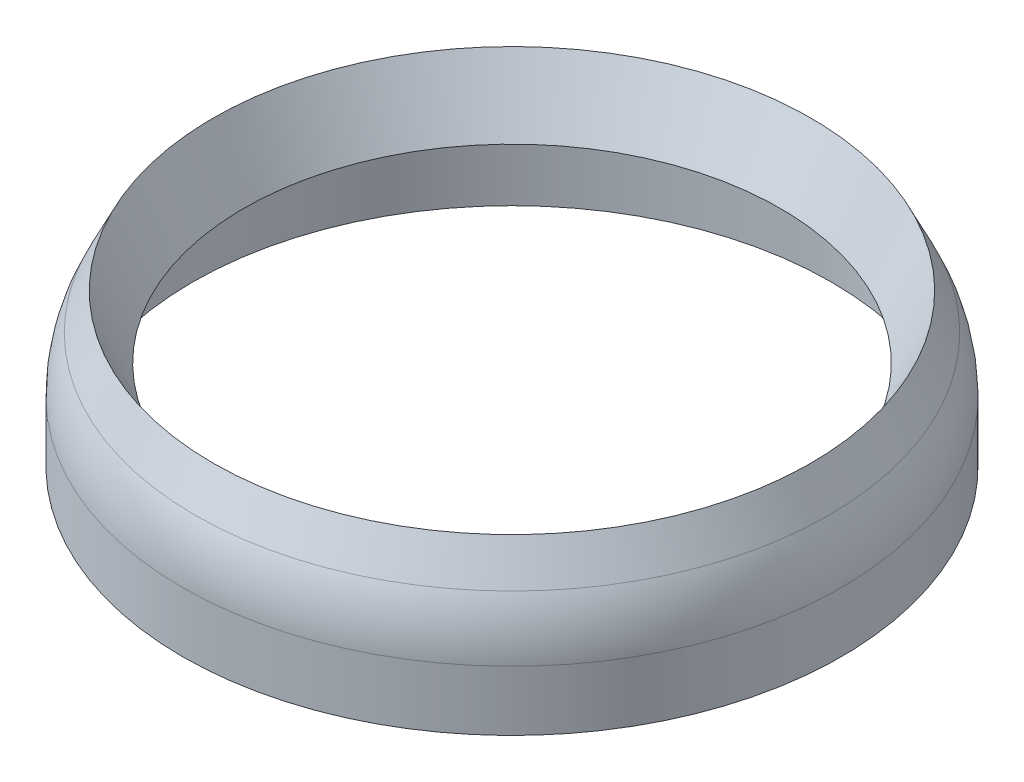
ISO-10303-21;
HEADER;
FILE_DESCRIPTION(('STEP AP214'),'2;1');
FILE_NAME('part.step','',(''),(''),'','','');
FILE_SCHEMA(('AUTOMOTIVE_DESIGN { 1 0 10303 214 1 1 1 1 }'));
ENDSEC;
DATA;
#1=APPLICATION_CONTEXT('core data for automotive mechanical design processes');
#2=APPLICATION_PROTOCOL_DEFINITION('international standard','automotive_design',2000,#1);
#3=PRODUCT_CONTEXT('',#1,'mechanical');
#4=PRODUCT('Part','Part','',(#3));
#5=PRODUCT_RELATED_PRODUCT_CATEGORY('part','',(#4));
#6=PRODUCT_DEFINITION_FORMATION('','',#4);
#7=PRODUCT_DEFINITION_CONTEXT('part definition',#1,'design');
#8=PRODUCT_DEFINITION('design','',#6,#7);
#9=PRODUCT_DEFINITION_SHAPE('','',#8);
#10=(LENGTH_UNIT() NAMED_UNIT(*) SI_UNIT(.MILLI.,.METRE.));
#11=(NAMED_UNIT(*) PLANE_ANGLE_UNIT() SI_UNIT($,.RADIAN.));
#12=(NAMED_UNIT(*) SI_UNIT($,.STERADIAN.) SOLID_ANGLE_UNIT());
#13=UNCERTAINTY_MEASURE_WITH_UNIT(LENGTH_MEASURE(1.E-05),#10,'distance_accuracy_value','');
#14=(GEOMETRIC_REPRESENTATION_CONTEXT(3) GLOBAL_UNCERTAINTY_ASSIGNED_CONTEXT((#13)) GLOBAL_UNIT_ASSIGNED_CONTEXT((#10,
#11,#12)) REPRESENTATION_CONTEXT('',''));
#15=CARTESIAN_POINT('',(0.,0.,0.));
#16=DIRECTION('',(0.,0.,1.));
#17=DIRECTION('',(1.,0.,0.));
#18=AXIS2_PLACEMENT_3D('',#15,#16,#17);
#19=CARTESIAN_POINT('',(0.,-7.,0.));
#20=DIRECTION('',(0.,1.,0.));
#21=DIRECTION('',(0.,0.,1.));
#22=AXIS2_PLACEMENT_3D('',#19,#20,#21);
#23=CYLINDRICAL_SURFACE('',#22,25.8);
#24=CARTESIAN_POINT('',(0.,-2.30868191125563,0.));
#25=DIRECTION('',(0.,-1.,0.));
#26=DIRECTION('',(0.,0.,-1.));
#27=AXIS2_PLACEMENT_3D('',#24,#25,#26);
#28=CIRCLE('',#27,25.8);
#29=CARTESIAN_POINT('',(0.,-2.30868191125563,-25.8));
#30=VERTEX_POINT('',#29);
#31=EDGE_CURVE('E10',#30,#30,#28,.T.);
#32=ORIENTED_EDGE('',*,*,#31,.T.);
#33=EDGE_LOOP('',(#32));
#34=FACE_BOUND('',#33,.T.);
#35=CARTESIAN_POINT('',(0.,-7.,0.));
#36=DIRECTION('',(0.,1.,0.));
#37=DIRECTION('',(0.,0.,1.));
#38=AXIS2_PLACEMENT_3D('',#35,#36,#37);
#39=CIRCLE('',#38,25.8);
#40=CARTESIAN_POINT('',(0.,-7.,25.8));
#41=VERTEX_POINT('',#40);
#42=EDGE_CURVE('E46',#41,#41,#39,.T.);
#43=ORIENTED_EDGE('',*,*,#42,.T.);
#44=EDGE_LOOP('',(#43));
#45=FACE_BOUND('',#44,.T.);
#46=ADVANCED_FACE('F35',(#34,#45),#23,.T.);
#47=CARTESIAN_POINT('',(0.,-7.,0.));
#48=DIRECTION('',(0.,1.,0.));
#49=DIRECTION('',(0.,0.,1.));
#50=AXIS2_PLACEMENT_3D('',#47,#48,#49);
#51=PLANE('',#50);
#52=CARTESIAN_POINT('',(0.,-7.,0.));
#53=DIRECTION('',(0.,1.,0.));
#54=DIRECTION('',(0.,0.,1.));
#55=AXIS2_PLACEMENT_3D('',#52,#53,#54);
#56=CIRCLE('',#55,25.);
#57=CARTESIAN_POINT('',(0.,-7.,25.));
#58=VERTEX_POINT('',#57);
#59=EDGE_CURVE('E50',#58,#58,#56,.T.);
#60=ORIENTED_EDGE('',*,*,#59,.T.);
#61=EDGE_LOOP('',(#60));
#62=FACE_BOUND('',#61,.T.);
#63=ORIENTED_EDGE('',*,*,#42,.F.);
#64=EDGE_LOOP('',(#63));
#65=FACE_BOUND('',#64,.T.);
#66=ADVANCED_FACE('F83',(#62,#65),#51,.F.);
#67=CARTESIAN_POINT('',(0.,-7.,0.));
#68=DIRECTION('',(0.,1.,0.));
#69=DIRECTION('',(0.,0.,1.));
#70=AXIS2_PLACEMENT_3D('',#67,#68,#69);
#71=CYLINDRICAL_SURFACE('',#70,25.);
#72=ORIENTED_EDGE('',*,*,#59,.F.);
#73=EDGE_LOOP('',(#72));
#74=FACE_BOUND('',#73,.T.);
#75=CARTESIAN_POINT('',(0.,0.,0.));
#76=DIRECTION('',(0.,1.,0.));
#77=DIRECTION('',(0.,0.,1.));
#78=AXIS2_PLACEMENT_3D('',#75,#76,#77);
#79=CIRCLE('',#78,25.);
#80=CARTESIAN_POINT('',(0.,0.,25.));
#81=VERTEX_POINT('',#80);
#82=EDGE_CURVE('E53',#81,#81,#79,.T.);
#83=ORIENTED_EDGE('',*,*,#82,.T.);
#84=EDGE_LOOP('',(#83));
#85=FACE_BOUND('',#84,.T.);
#86=ADVANCED_FACE('F87',(#74,#85),#71,.F.);
#87=CARTESIAN_POINT('',(0.,0.,0.));
#88=DIRECTION('',(0.,1.,0.));
#89=DIRECTION('',(0.,0.,1.));
#90=AXIS2_PLACEMENT_3D('',#87,#88,#89);
#91=PLANE('',#90);
#92=CARTESIAN_POINT('',(0.,0.,0.));
#93=DIRECTION('',(0.,1.,0.));
#94=DIRECTION('',(0.,0.,1.));
#95=AXIS2_PLACEMENT_3D('',#92,#93,#94);
#96=CIRCLE('',#95,21.);
#97=CARTESIAN_POINT('',(0.,0.,21.));
#98=VERTEX_POINT('',#97);
#99=EDGE_CURVE('E61',#98,#98,#96,.T.);
#100=ORIENTED_EDGE('',*,*,#99,.T.);
#101=EDGE_LOOP('',(#100));
#102=FACE_BOUND('',#101,.T.);
#103=ORIENTED_EDGE('',*,*,#82,.F.);
#104=EDGE_LOOP('',(#103));
#105=FACE_BOUND('',#104,.T.);
#106=ADVANCED_FACE('F65',(#102,#105),#91,.F.);
#107=CARTESIAN_POINT('',(0.,0.,0.));
#108=DIRECTION('',(0.,1.,0.));
#109=DIRECTION('',(0.,0.,1.));
#110=AXIS2_PLACEMENT_3D('',#107,#108,#109);
#111=CONICAL_SURFACE('',#110,21.,0.453785605518526);
#112=ORIENTED_EDGE('',*,*,#99,.F.);
#113=EDGE_LOOP('',(#112));
#114=FACE_BOUND('',#113,.T.);
#115=CARTESIAN_POINT('',(0.,4.9207292197903,0.));
#116=DIRECTION('',(0.,1.,0.));
#117=DIRECTION('',(0.,0.,1.));
#118=AXIS2_PLACEMENT_3D('',#115,#116,#117);
#119=CIRCLE('',#118,23.4);
#120=CARTESIAN_POINT('',(0.,4.9207292197903,23.4));
#121=VERTEX_POINT('',#120);
#122=EDGE_CURVE('E56',#121,#121,#119,.T.);
#123=ORIENTED_EDGE('',*,*,#122,.T.);
#124=EDGE_LOOP('',(#123));
#125=FACE_BOUND('',#124,.T.);
#126=ADVANCED_FACE('F68',(#114,#125),#111,.F.);
#127=CARTESIAN_POINT('',(0.,0.,0.));
#128=DIRECTION('',(0.,-1.,0.));
#129=DIRECTION('',(0.,0.,1.));
#130=AXIS2_PLACEMENT_3D('',#127,#128,#129);
#131=CONICAL_SURFACE('',#130,25.8,0.453785605518526);
#132=CARTESIAN_POINT('',(0.,2.07502955663514,0.));
#133=DIRECTION('',(0.,-1.,0.));
#134=DIRECTION('',(0.,0.,-1.));
#135=AXIS2_PLACEMENT_3D('',#132,#133,#134);
#136=CIRCLE('',#135,24.7879404629917);
#137=CARTESIAN_POINT('',(0.,2.07502955663514,-24.7879404629917));
#138=VERTEX_POINT('',#137);
#139=EDGE_CURVE('E42',#138,#138,#136,.F.);
#140=ORIENTED_EDGE('',*,*,#139,.T.);
#141=EDGE_LOOP('',(#140));
#142=FACE_BOUND('',#141,.T.);
#143=ORIENTED_EDGE('',*,*,#122,.F.);
#144=EDGE_LOOP('',(#143));
#145=FACE_BOUND('',#144,.T.);
#146=ADVANCED_FACE('F71',(#142,#145),#131,.T.);
#147=CARTESIAN_POINT('',(0.,-2.30868191125563,0.));
#148=DIRECTION('',(0.,-1.,0.));
#149=DIRECTION('',(0.,0.,-1.));
#150=AXIS2_PLACEMENT_3D('',#147,#148,#149);
#151=TOROIDAL_SURFACE('',#150,15.8,10.);
#152=ORIENTED_EDGE('',*,*,#31,.F.);
#153=EDGE_LOOP('',(#152));
#154=FACE_BOUND('',#153,.T.);
#155=ORIENTED_EDGE('',*,*,#139,.F.);
#156=EDGE_LOOP('',(#155));
#157=FACE_BOUND('',#156,.T.);
#158=ADVANCED_FACE('F37',(#154,#157),#151,.T.);
#159=CLOSED_SHELL('',(#46,#66,#86,#106,#126,#146,#158));
#160=MANIFOLD_SOLID_BREP('B2',#159);
#161=ADVANCED_BREP_SHAPE_REPRESENTATION('',(#18,#160),#14);
#162=SHAPE_DEFINITION_REPRESENTATION(#9,#161);
ENDSEC;
END-ISO-10303-21;
